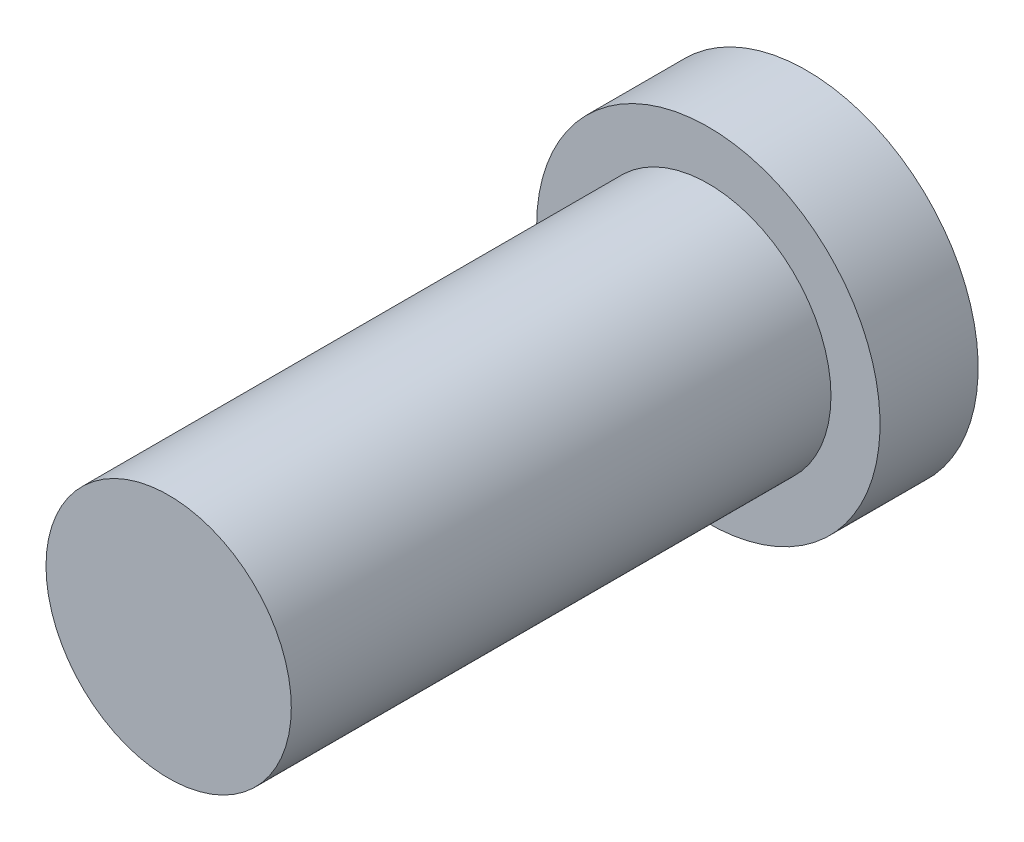
ISO-10303-21;
HEADER;
FILE_DESCRIPTION(('STEP AP214'),'2;1');
FILE_NAME('part.step','',(''),(''),'','','');
FILE_SCHEMA(('AUTOMOTIVE_DESIGN { 1 0 10303 214 1 1 1 1 }'));
ENDSEC;
DATA;
#1=APPLICATION_CONTEXT('core data for automotive mechanical design processes');
#2=APPLICATION_PROTOCOL_DEFINITION('international standard','automotive_design',2000,#1);
#3=PRODUCT_CONTEXT('',#1,'mechanical');
#4=PRODUCT('Part','Part','',(#3));
#5=PRODUCT_RELATED_PRODUCT_CATEGORY('part','',(#4));
#6=PRODUCT_DEFINITION_FORMATION('','',#4);
#7=PRODUCT_DEFINITION_CONTEXT('part definition',#1,'design');
#8=PRODUCT_DEFINITION('design','',#6,#7);
#9=PRODUCT_DEFINITION_SHAPE('','',#8);
#10=(LENGTH_UNIT() NAMED_UNIT(*) SI_UNIT(.MILLI.,.METRE.));
#11=(NAMED_UNIT(*) PLANE_ANGLE_UNIT() SI_UNIT($,.RADIAN.));
#12=(NAMED_UNIT(*) SI_UNIT($,.STERADIAN.) SOLID_ANGLE_UNIT());
#13=UNCERTAINTY_MEASURE_WITH_UNIT(LENGTH_MEASURE(1.E-05),#10,'distance_accuracy_value','');
#14=(GEOMETRIC_REPRESENTATION_CONTEXT(3) GLOBAL_UNCERTAINTY_ASSIGNED_CONTEXT((#13)) GLOBAL_UNIT_ASSIGNED_CONTEXT((#10,
#11,#12)) REPRESENTATION_CONTEXT('',''));
#15=CARTESIAN_POINT('',(0.,0.,0.));
#16=DIRECTION('',(0.,0.,1.));
#17=DIRECTION('',(1.,0.,0.));
#18=AXIS2_PLACEMENT_3D('',#15,#16,#17);
#19=CARTESIAN_POINT('',(0.,0.,22.));
#20=DIRECTION('',(0.,0.,-1.));
#21=DIRECTION('',(-1.,0.,0.));
#22=AXIS2_PLACEMENT_3D('',#19,#20,#21);
#23=CYLINDRICAL_SURFACE('',#22,5.);
#24=CARTESIAN_POINT('',(0.,0.,22.));
#25=DIRECTION('',(0.,0.,1.));
#26=DIRECTION('',(1.,0.,0.));
#27=AXIS2_PLACEMENT_3D('',#24,#25,#26);
#28=CIRCLE('',#27,5.);
#29=CARTESIAN_POINT('',(5.,0.,22.));
#30=VERTEX_POINT('',#29);
#31=EDGE_CURVE('E10',#30,#30,#28,.T.);
#32=ORIENTED_EDGE('',*,*,#31,.F.);
#33=EDGE_LOOP('',(#32));
#34=FACE_BOUND('',#33,.T.);
#35=CARTESIAN_POINT('',(0.,0.,0.));
#36=DIRECTION('',(0.,0.,1.));
#37=DIRECTION('',(1.,0.,0.));
#38=AXIS2_PLACEMENT_3D('',#35,#36,#37);
#39=CIRCLE('',#38,5.);
#40=CARTESIAN_POINT('',(5.,0.,0.));
#41=VERTEX_POINT('',#40);
#42=EDGE_CURVE('E44',#41,#41,#39,.T.);
#43=ORIENTED_EDGE('',*,*,#42,.T.);
#44=EDGE_LOOP('',(#43));
#45=FACE_BOUND('',#44,.T.);
#46=ADVANCED_FACE('F41',(#34,#45),#23,.T.);
#47=CARTESIAN_POINT('',(0.,0.,22.));
#48=DIRECTION('',(0.,0.,1.));
#49=DIRECTION('',(1.,0.,0.));
#50=AXIS2_PLACEMENT_3D('',#47,#48,#49);
#51=PLANE('',#50);
#52=ORIENTED_EDGE('',*,*,#31,.T.);
#53=EDGE_LOOP('',(#52));
#54=FACE_BOUND('',#53,.T.);
#55=ADVANCED_FACE('F68',(#54),#51,.T.);
#56=CARTESIAN_POINT('',(0.,0.,-4.));
#57=DIRECTION('',(0.,0.,1.));
#58=DIRECTION('',(1.,0.,0.));
#59=AXIS2_PLACEMENT_3D('',#56,#57,#58);
#60=CYLINDRICAL_SURFACE('',#59,7.);
#61=CARTESIAN_POINT('',(0.,0.,-4.));
#62=DIRECTION('',(0.,0.,-1.));
#63=DIRECTION('',(-1.,0.,0.));
#64=AXIS2_PLACEMENT_3D('',#61,#62,#63);
#65=CIRCLE('',#64,7.);
#66=CARTESIAN_POINT('',(-7.,0.,-4.));
#67=VERTEX_POINT('',#66);
#68=EDGE_CURVE('E53',#67,#67,#65,.T.);
#69=ORIENTED_EDGE('',*,*,#68,.F.);
#70=EDGE_LOOP('',(#69));
#71=FACE_BOUND('',#70,.T.);
#72=CARTESIAN_POINT('',(0.,0.,0.));
#73=DIRECTION('',(0.,0.,-1.));
#74=DIRECTION('',(-1.,0.,0.));
#75=AXIS2_PLACEMENT_3D('',#72,#73,#74);
#76=CIRCLE('',#75,7.);
#77=CARTESIAN_POINT('',(-7.,0.,0.));
#78=VERTEX_POINT('',#77);
#79=EDGE_CURVE('E55',#78,#78,#76,.T.);
#80=ORIENTED_EDGE('',*,*,#79,.T.);
#81=EDGE_LOOP('',(#80));
#82=FACE_BOUND('',#81,.T.);
#83=ADVANCED_FACE('F65',(#71,#82),#60,.T.);
#84=CARTESIAN_POINT('',(0.,0.,-4.));
#85=DIRECTION('',(0.,0.,-1.));
#86=DIRECTION('',(-1.,0.,0.));
#87=AXIS2_PLACEMENT_3D('',#84,#85,#86);
#88=PLANE('',#87);
#89=ORIENTED_EDGE('',*,*,#68,.T.);
#90=EDGE_LOOP('',(#89));
#91=FACE_BOUND('',#90,.T.);
#92=ADVANCED_FACE('F63',(#91),#88,.T.);
#93=CARTESIAN_POINT('',(0.,0.,0.));
#94=DIRECTION('',(0.,0.,-1.));
#95=DIRECTION('',(-1.,0.,0.));
#96=AXIS2_PLACEMENT_3D('',#93,#94,#95);
#97=PLANE('',#96);
#98=ORIENTED_EDGE('',*,*,#42,.F.);
#99=EDGE_LOOP('',(#98));
#100=FACE_BOUND('',#99,.T.);
#101=ORIENTED_EDGE('',*,*,#79,.F.);
#102=EDGE_LOOP('',(#101));
#103=FACE_BOUND('',#102,.T.);
#104=ADVANCED_FACE('F72',(#100,#103),#97,.F.);
#105=CLOSED_SHELL('',(#46,#55,#83,#92,#104));
#106=MANIFOLD_SOLID_BREP('B2',#105);
#107=ADVANCED_BREP_SHAPE_REPRESENTATION('',(#18,#106),#14);
#108=SHAPE_DEFINITION_REPRESENTATION(#9,#107);
ENDSEC;
END-ISO-10303-21;
